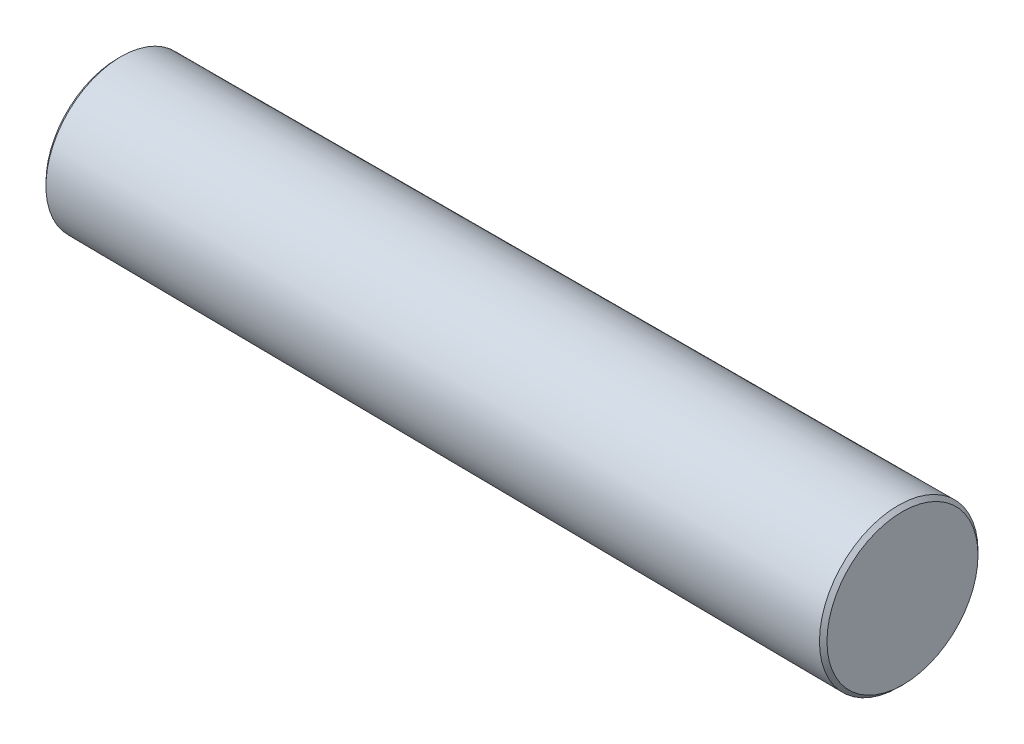
ISO-10303-21;
HEADER;
FILE_DESCRIPTION(('STEP AP214'),'2;1');
FILE_NAME('part.step','',(''),(''),'','','');
FILE_SCHEMA(('AUTOMOTIVE_DESIGN { 1 0 10303 214 1 1 1 1 }'));
ENDSEC;
DATA;
#1=APPLICATION_CONTEXT('core data for automotive mechanical design processes');
#2=APPLICATION_PROTOCOL_DEFINITION('international standard','automotive_design',2000,#1);
#3=PRODUCT_CONTEXT('',#1,'mechanical');
#4=PRODUCT('Part','Part','',(#3));
#5=PRODUCT_RELATED_PRODUCT_CATEGORY('part','',(#4));
#6=PRODUCT_DEFINITION_FORMATION('','',#4);
#7=PRODUCT_DEFINITION_CONTEXT('part definition',#1,'design');
#8=PRODUCT_DEFINITION('design','',#6,#7);
#9=PRODUCT_DEFINITION_SHAPE('','',#8);
#10=(LENGTH_UNIT() NAMED_UNIT(*) SI_UNIT(.MILLI.,.METRE.));
#11=(NAMED_UNIT(*) PLANE_ANGLE_UNIT() SI_UNIT($,.RADIAN.));
#12=(NAMED_UNIT(*) SI_UNIT($,.STERADIAN.) SOLID_ANGLE_UNIT());
#13=UNCERTAINTY_MEASURE_WITH_UNIT(LENGTH_MEASURE(1.E-05),#10,'distance_accuracy_value','');
#14=(GEOMETRIC_REPRESENTATION_CONTEXT(3) GLOBAL_UNCERTAINTY_ASSIGNED_CONTEXT((#13)) GLOBAL_UNIT_ASSIGNED_CONTEXT((#10,
#11,#12)) REPRESENTATION_CONTEXT('',''));
#15=CARTESIAN_POINT('',(0.,0.,0.));
#16=DIRECTION('',(0.,0.,1.));
#17=DIRECTION('',(1.,0.,0.));
#18=AXIS2_PLACEMENT_3D('',#15,#16,#17);
#19=CARTESIAN_POINT('',(10.5,0.,0.101291178236258));
#20=DIRECTION('',(-0.999988367660126,0.,-0.00482333333251647));
#21=DIRECTION('',(-0.00482333333251647,0.,0.999988367660126));
#22=AXIS2_PLACEMENT_3D('',#19,#20,#21);
#23=CONICAL_SURFACE('',#22,0.,1.56597297476007);
#24=CARTESIAN_POINT('',(10.4903472178377,0.,0.101244619108711));
#25=DIRECTION('',(0.999988367660126,0.,0.00482333333251389));
#26=DIRECTION('',(0.00482333333251389,0.,-0.999988367660126));
#27=AXIS2_PLACEMENT_3D('',#24,#25,#26);
#28=CIRCLE('',#27,2.00126789853709);
#29=CARTESIAN_POINT('',(10.5,0.,-1.9));
#30=VERTEX_POINT('',#29);
#31=EDGE_CURVE('E51',#30,#30,#28,.T.);
#32=ORIENTED_EDGE('',*,*,#31,.T.);
#33=EDGE_LOOP('',(#32));
#34=FACE_BOUND('',#33,.T.);
#35=CARTESIAN_POINT('',(10.5,0.,0.101291178236258));
#36=VERTEX_POINT('',#35);
#37=VERTEX_LOOP('',#36);
#38=FACE_BOUND('',#37,.T.);
#39=ADVANCED_FACE('F41',(#34,#38),#23,.T.);
#40=CARTESIAN_POINT('',(-10.5096465544517,0.,-4.6529088872655E-05));
#41=DIRECTION('',(-0.999988367660126,0.,-0.00482333333251647));
#42=DIRECTION('',(-0.00482333333251647,0.,0.999988367660126));
#43=AXIS2_PLACEMENT_3D('',#40,#41,#42);
#44=CONICAL_SURFACE('',#43,1.99997673532025,1.56597297476008);
#45=CARTESIAN_POINT('',(-10.5091642267291,0.,-4.42026344289971E-05));
#46=DIRECTION('',(0.999988367660126,0.,0.00482333333251698));
#47=DIRECTION('',(0.00482333333251698,0.,-0.999988367660126));
#48=AXIS2_PLACEMENT_3D('',#45,#46,#47);
#49=CIRCLE('',#48,1.89997789855418);
#50=CARTESIAN_POINT('',(-10.5,0.,-1.89999999999994));
#51=VERTEX_POINT('',#50);
#52=EDGE_CURVE('E11',#51,#51,#49,.F.);
#53=ORIENTED_EDGE('',*,*,#52,.T.);
#54=EDGE_LOOP('',(#53));
#55=FACE_BOUND('',#54,.T.);
#56=CARTESIAN_POINT('',(-10.5,0.,0.));
#57=VERTEX_POINT('',#56);
#58=VERTEX_LOOP('',#57);
#59=FACE_BOUND('',#58,.T.);
#60=ADVANCED_FACE('F57',(#55,#59),#44,.F.);
#61=CARTESIAN_POINT('',(10.4898648901151,0.,0.101242292654268));
#62=DIRECTION('',(0.999988367660126,0.,0.00482333333251647));
#63=DIRECTION('',(0.00482333333251647,0.,-0.999988367660126));
#64=AXIS2_PLACEMENT_3D('',#61,#62,#63);
#65=CONICAL_SURFACE('',#64,2.1012667353031,0.00482335203482103);
#66=CARTESIAN_POINT('',(10.3898672165696,0.,0.100759964931682));
#67=DIRECTION('',(-0.999988367660126,0.,-0.00482333333251389));
#68=DIRECTION('',(-0.00482333333251389,0.,0.999988367660126));
#69=AXIS2_PLACEMENT_3D('',#66,#67,#68);
#70=CIRCLE('',#69,2.10078440196985);
#71=CARTESIAN_POINT('',(10.3797344331392,0.,2.20151992986336));
#72=VERTEX_POINT('',#71);
#73=EDGE_CURVE('E85',#72,#72,#70,.T.);
#74=ORIENTED_EDGE('',*,*,#73,.T.);
#75=EDGE_LOOP('',(#74));
#76=FACE_BOUND('',#75,.T.);
#77=CARTESIAN_POINT('',(-10.409648880906,0.,0.000435798633715168));
#78=DIRECTION('',(-0.999988367660126,0.,-0.00482333333251698));
#79=DIRECTION('',(-0.00482333333251698,0.,0.999988367660126));
#80=AXIS2_PLACEMENT_3D('',#77,#78,#79);
#81=CIRCLE('',#80,2.0004590686535);
#82=CARTESIAN_POINT('',(-10.3999999999998,0.,-2.00000000000011));
#83=VERTEX_POINT('',#82);
#84=EDGE_CURVE('E87',#83,#83,#81,.F.);
#85=ORIENTED_EDGE('',*,*,#84,.T.);
#86=EDGE_LOOP('',(#85));
#87=FACE_BOUND('',#86,.T.);
#88=ADVANCED_FACE('F59',(#76,#87),#65,.T.);
#89=CARTESIAN_POINT('',(10.3898672165696,0.,0.100759964931682));
#90=DIRECTION('',(-0.999988367660126,0.,-0.00482333333251389));
#91=DIRECTION('',(-0.00482333333251389,0.,0.999988367660126));
#92=AXIS2_PLACEMENT_3D('',#89,#90,#91);
#93=CONICAL_SURFACE('',#92,2.10078440196985,0.780574811362805);
#94=ORIENTED_EDGE('',*,*,#31,.F.);
#95=EDGE_LOOP('',(#94));
#96=FACE_BOUND('',#95,.T.);
#97=ORIENTED_EDGE('',*,*,#73,.F.);
#98=EDGE_LOOP('',(#97));
#99=FACE_BOUND('',#98,.T.);
#100=ADVANCED_FACE('F66',(#96,#99),#93,.T.);
#101=CARTESIAN_POINT('',(-10.5091642267291,0.,-4.42026344289971E-05));
#102=DIRECTION('',(0.999988367660126,0.,0.00482333333251698));
#103=DIRECTION('',(0.00482333333251698,0.,-0.999988367660126));
#104=AXIS2_PLACEMENT_3D('',#101,#102,#103);
#105=CONICAL_SURFACE('',#104,1.89997789855418,0.790221515432025);
#106=CARTESIAN_POINT('',(-10.3999999999998,0.,-2.00000000000011));
#107=CARTESIAN_POINT('',(-10.4010416666664,0.,-1.99895833333344));
#108=CARTESIAN_POINT('',(-10.4020833333331,0.,-1.99791666666677));
#109=CARTESIAN_POINT('',(-10.4041666666665,0.,-1.99583333333344));
#110=CARTESIAN_POINT('',(-10.4052083333331,0.,-1.99479166666677));
#111=CARTESIAN_POINT('',(-10.4072916666665,0.,-1.99270833333343));
#112=CARTESIAN_POINT('',(-10.4083333333331,0.,-1.99166666666676));
#113=CARTESIAN_POINT('',(-10.4104166666665,0.,-1.98958333333343));
#114=CARTESIAN_POINT('',(-10.4114583333331,0.,-1.98854166666676));
#115=CARTESIAN_POINT('',(-10.4135416666665,0.,-1.98645833333342));
#116=CARTESIAN_POINT('',(-10.4145833333331,0.,-1.98541666666675));
#117=CARTESIAN_POINT('',(-10.4166666666665,0.,-1.98333333333342));
#118=CARTESIAN_POINT('',(-10.4177083333332,0.,-1.98229166666675));
#119=CARTESIAN_POINT('',(-10.4197916666665,0.,-1.98020833333341));
#120=CARTESIAN_POINT('',(-10.4208333333332,0.,-1.97916666666674));
#121=CARTESIAN_POINT('',(-10.4229166666665,0.,-1.97708333333341));
#122=CARTESIAN_POINT('',(-10.4239583333332,0.,-1.97604166666674));
#123=CARTESIAN_POINT('',(-10.4260416666665,0.,-1.9739583333334));
#124=CARTESIAN_POINT('',(-10.4270833333332,0.,-1.97291666666673));
#125=CARTESIAN_POINT('',(-10.4291666666665,0.,-1.97083333333339));
#126=CARTESIAN_POINT('',(-10.4302083333332,0.,-1.96979166666673));
#127=CARTESIAN_POINT('',(-10.4322916666665,0.,-1.96770833333339));
#128=CARTESIAN_POINT('',(-10.4333333333332,0.,-1.96666666666672));
#129=CARTESIAN_POINT('',(-10.4354166666665,0.,-1.96458333333338));
#130=CARTESIAN_POINT('',(-10.4364583333332,0.,-1.96354166666672));
#131=CARTESIAN_POINT('',(-10.4385416666665,0.,-1.96145833333338));
#132=CARTESIAN_POINT('',(-10.4395833333332,0.,-1.96041666666671));
#133=CARTESIAN_POINT('',(-10.4416666666665,0.,-1.95833333333337));
#134=CARTESIAN_POINT('',(-10.4427083333332,0.,-1.9572916666667));
#135=CARTESIAN_POINT('',(-10.4447916666665,0.,-1.95520833333337));
#136=CARTESIAN_POINT('',(-10.4458333333332,0.,-1.9541666666667));
#137=CARTESIAN_POINT('',(-10.4479166666666,0.,-1.95208333333336));
#138=CARTESIAN_POINT('',(-10.4489583333332,0.,-1.95104166666669));
#139=CARTESIAN_POINT('',(-10.4510416666666,0.,-1.94895833333336));
#140=CARTESIAN_POINT('',(-10.4520833333332,0.,-1.94791666666669));
#141=CARTESIAN_POINT('',(-10.4541666666666,0.,-1.94583333333335));
#142=CARTESIAN_POINT('',(-10.4552083333332,0.,-1.94479166666668));
#143=CARTESIAN_POINT('',(-10.4572916666666,0.,-1.94270833333335));
#144=CARTESIAN_POINT('',(-10.4583333333332,0.,-1.94166666666668));
#145=CARTESIAN_POINT('',(-10.4604166666666,0.,-1.93958333333334));
#146=CARTESIAN_POINT('',(-10.4614583333332,0.,-1.93854166666667));
#147=CARTESIAN_POINT('',(-10.4635416666666,0.,-1.93645833333334));
#148=CARTESIAN_POINT('',(-10.4645833333333,0.,-1.93541666666667));
#149=CARTESIAN_POINT('',(-10.4666666666666,0.,-1.93333333333333));
#150=CARTESIAN_POINT('',(-10.4677083333333,0.,-1.93229166666666));
#151=CARTESIAN_POINT('',(-10.4697916666666,0.,-1.93020833333333));
#152=CARTESIAN_POINT('',(-10.4708333333333,0.,-1.92916666666666));
#153=CARTESIAN_POINT('',(-10.4729166666666,0.,-1.92708333333332));
#154=CARTESIAN_POINT('',(-10.4739583333333,0.,-1.92604166666665));
#155=CARTESIAN_POINT('',(-10.4760416666666,0.,-1.92395833333332));
#156=CARTESIAN_POINT('',(-10.4770833333333,0.,-1.92291666666665));
#157=CARTESIAN_POINT('',(-10.4791666666666,0.,-1.92083333333331));
#158=CARTESIAN_POINT('',(-10.4802083333333,0.,-1.91979166666664));
#159=CARTESIAN_POINT('',(-10.4822916666666,0.,-1.91770833333331));
#160=CARTESIAN_POINT('',(-10.4833333333333,0.,-1.91666666666664));
#161=CARTESIAN_POINT('',(-10.4854166666666,0.,-1.9145833333333));
#162=CARTESIAN_POINT('',(-10.4864583333333,0.,-1.91354166666663));
#163=CARTESIAN_POINT('',(-10.4885416666666,0.,-1.91145833333329));
#164=CARTESIAN_POINT('',(-10.4895833333333,0.,-1.91041666666663));
#165=CARTESIAN_POINT('',(-10.4916666666666,0.,-1.90833333333329));
#166=CARTESIAN_POINT('',(-10.4927083333333,0.,-1.90729166666662));
#167=CARTESIAN_POINT('',(-10.4947916666667,0.,-1.90520833333328));
#168=CARTESIAN_POINT('',(-10.4958333333333,0.,-1.90416666666661));
#169=CARTESIAN_POINT('',(-10.4979166666667,0.,-1.90208333333328));
#170=CARTESIAN_POINT('',(-10.4989583333333,0.,-1.90104166666661));
#171=CARTESIAN_POINT('',(-10.5,0.,-1.89999999999994));
#172=B_SPLINE_CURVE_WITH_KNOTS('',3,(#106,#107,#108,#109,#110,#111,#112,#113,#114,#115,#116,
#117,#118,#119,#120,#121,#122,#123,#124,#125,#126,#127,#128,#129,#130,#131,#132,#133,#134,#135,
#136,#137,#138,#139,#140,#141,#142,#143,#144,#145,#146,#147,#148,#149,#150,#151,#152,#153,#154,
#155,#156,#157,#158,#159,#160,#161,#162,#163,#164,#165,#166,#167,#168,#169,#170,#171),
.UNSPECIFIED.,.F.,.F.,(4,2,2,2,2,2,2,2,2,2,2,2,2,2,2,2,2,2,2,2,2,2,2,2,2,2,2,2,2,2,2,2,4),(0.,
0.00441941738242494,0.00883883476484927,0.0132582521472733,0.0176776695296992,
0.0220970869121232,0.0265165042945466,0.0309359216769718,0.0353553390593962,0.0397747564418205,
0.044194173824246,0.0486135912066692,0.0530330085890935,0.057452425971519,0.0618718433539434,
0.0662912607363677,0.0707106781187919,0.0751300955012163,0.0795495128836408,0.0839689302660664,
0.0883883476484905,0.0928077650309149,0.097227182413338,0.101646599795764,0.106066017178188,
0.110485434560612,0.114904851943038,0.119324269325461,0.123743686707885,0.128163104090311,
0.132582521472735,0.137001938855159,0.141421356237585),.UNSPECIFIED.);
#173=EDGE_CURVE('BSEAM44',#83,#51,#172,.T.);
#174=ORIENTED_EDGE('',*,*,#84,.F.);
#175=ORIENTED_EDGE('',*,*,#52,.F.);
#176=ORIENTED_EDGE('',*,*,#173,.T.);
#177=ORIENTED_EDGE('',*,*,#173,.F.);
#178=EDGE_LOOP('',(#174,#176,#175,#177));
#179=FACE_BOUND('',#178,.T.);
#180=ADVANCED_FACE('F44',(#179),#105,.T.);
#181=CLOSED_SHELL('',(#39,#60,#88,#100,#180));
#182=MANIFOLD_SOLID_BREP('B2',#181);
#183=ADVANCED_BREP_SHAPE_REPRESENTATION('',(#18,#182),#14);
#184=SHAPE_DEFINITION_REPRESENTATION(#9,#183);
ENDSEC;
END-ISO-10303-21;
